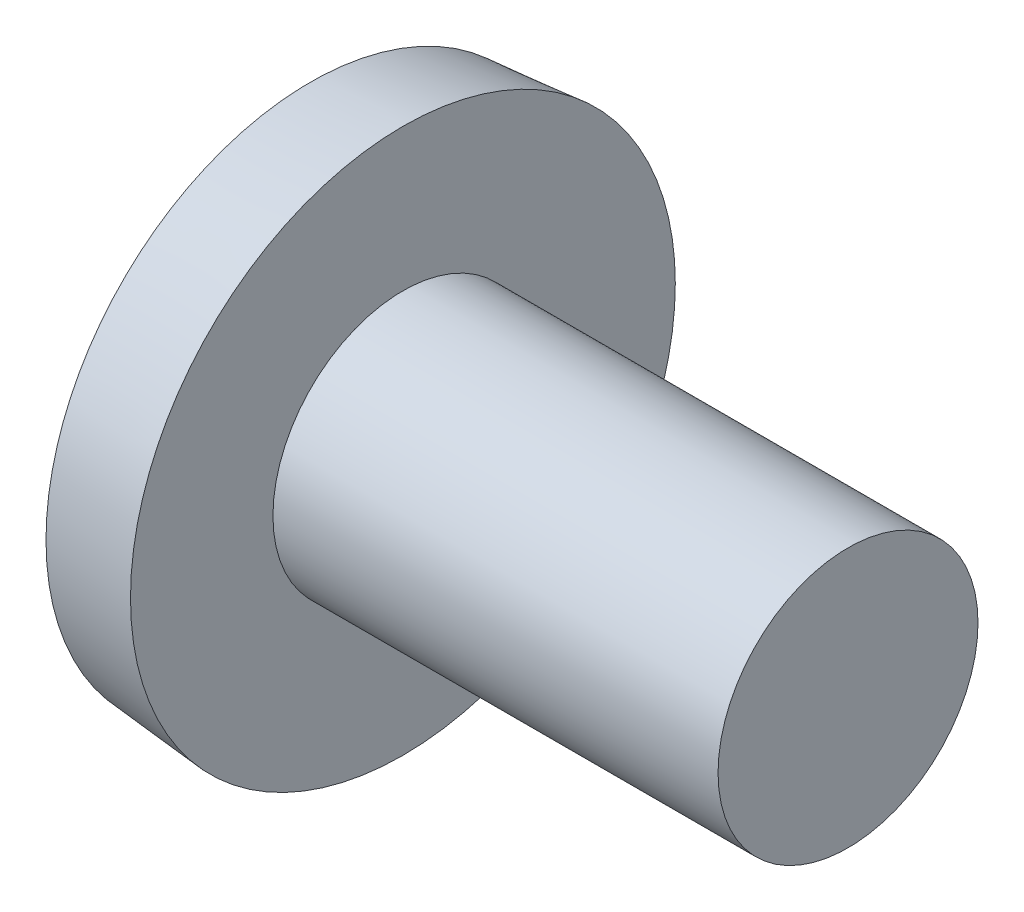
ISO-10303-21;
HEADER;
FILE_DESCRIPTION(('STEP AP214'),'2;1');
FILE_NAME('part.step','',(''),(''),'','','');
FILE_SCHEMA(('AUTOMOTIVE_DESIGN { 1 0 10303 214 1 1 1 1 }'));
ENDSEC;
DATA;
#1=APPLICATION_CONTEXT('core data for automotive mechanical design processes');
#2=APPLICATION_PROTOCOL_DEFINITION('international standard','automotive_design',2000,#1);
#3=PRODUCT_CONTEXT('',#1,'mechanical');
#4=PRODUCT('Part','Part','',(#3));
#5=PRODUCT_RELATED_PRODUCT_CATEGORY('part','',(#4));
#6=PRODUCT_DEFINITION_FORMATION('','',#4);
#7=PRODUCT_DEFINITION_CONTEXT('part definition',#1,'design');
#8=PRODUCT_DEFINITION('design','',#6,#7);
#9=PRODUCT_DEFINITION_SHAPE('','',#8);
#10=(LENGTH_UNIT() NAMED_UNIT(*) SI_UNIT(.MILLI.,.METRE.));
#11=(NAMED_UNIT(*) PLANE_ANGLE_UNIT() SI_UNIT($,.RADIAN.));
#12=(NAMED_UNIT(*) SI_UNIT($,.STERADIAN.) SOLID_ANGLE_UNIT());
#13=UNCERTAINTY_MEASURE_WITH_UNIT(LENGTH_MEASURE(1.E-05),#10,'distance_accuracy_value','');
#14=(GEOMETRIC_REPRESENTATION_CONTEXT(3) GLOBAL_UNCERTAINTY_ASSIGNED_CONTEXT((#13)) GLOBAL_UNIT_ASSIGNED_CONTEXT((#10,
#11,#12)) REPRESENTATION_CONTEXT('',''));
#15=CARTESIAN_POINT('',(0.,0.,0.));
#16=DIRECTION('',(0.,0.,1.));
#17=DIRECTION('',(1.,0.,0.));
#18=AXIS2_PLACEMENT_3D('',#15,#16,#17);
#19=CARTESIAN_POINT('',(4.85512057546957,0.,0.));
#20=DIRECTION('',(-1.,0.,0.));
#21=DIRECTION('',(0.,1.,0.));
#22=AXIS2_PLACEMENT_3D('',#19,#20,#21);
#23=SPHERICAL_SURFACE('',#22,4.85512057546957);
#24=CARTESIAN_POINT('',(0.380999999999999,0.,0.));
#25=DIRECTION('',(-1.,0.,0.));
#26=DIRECTION('',(0.,0.,1.));
#27=AXIS2_PLACEMENT_3D('',#24,#25,#26);
#28=CIRCLE('',#27,1.88532248660748);
#29=CARTESIAN_POINT('',(0.380999999999999,0.,1.88532248660748));
#30=VERTEX_POINT('',#29);
#31=EDGE_CURVE('E153',#30,#30,#28,.T.);
#32=ORIENTED_EDGE('',*,*,#31,.T.);
#33=EDGE_LOOP('',(#32));
#34=FACE_BOUND('',#33,.T.);
#35=CARTESIAN_POINT('',(4.82161757223413,0.,-0.273384506401241));
#36=DIRECTION('',(-0.121639020177934,0.,-0.99257440465194));
#37=DIRECTION('',(-0.99257440465194,0.,0.121639020177934));
#38=AXIS2_PLACEMENT_3D('',#35,#36,#37);
#39=CIRCLE('',#38,4.84730175074566);
#40=CARTESIAN_POINT('',(0.139616751151113,1.11623710321305,0.300390104025599));
#41=VERTEX_POINT('',#40);
#42=CARTESIAN_POINT('',(0.0204791183434092,0.314990304124582,0.314990304124582));
#43=VERTEX_POINT('',#42);
#44=EDGE_CURVE('E124',#41,#43,#39,.F.);
#45=ORIENTED_EDGE('',*,*,#44,.T.);
#46=CARTESIAN_POINT('',(4.82161757223413,-0.273384506401242,0.));
#47=DIRECTION('',(-0.121639020177934,-0.99257440465194,0.));
#48=DIRECTION('',(0.99257440465194,-0.121639020177934,0.));
#49=AXIS2_PLACEMENT_3D('',#46,#47,#48);
#50=CIRCLE('',#49,4.84730175074566);
#51=CARTESIAN_POINT('',(0.139616751151112,0.300390104025596,1.11623710321305));
#52=VERTEX_POINT('',#51);
#53=EDGE_CURVE('E105',#43,#52,#50,.F.);
#54=ORIENTED_EDGE('',*,*,#53,.T.);
#55=CARTESIAN_POINT('',(3.48435644539866,0.,-1.65465019251163));
#56=DIRECTION('',(0.637953912582579,0.,0.770074545365953));
#57=DIRECTION('',(0.770074545365953,0.,-0.637953912582579));
#58=AXIS2_PLACEMENT_3D('',#55,#56,#57);
#59=CIRCLE('',#58,4.35377241509936);
#60=CARTESIAN_POINT('',(0.139616751151112,-0.300390104025603,1.11623710321305));
#61=VERTEX_POINT('',#60);
#62=EDGE_CURVE('E116',#61,#52,#59,.F.);
#63=ORIENTED_EDGE('',*,*,#62,.F.);
#64=CARTESIAN_POINT('',(4.82161757223413,0.273384506401241,0.));
#65=DIRECTION('',(-0.121639020177934,0.99257440465194,0.));
#66=DIRECTION('',(-0.99257440465194,-0.121639020177934,0.));
#67=AXIS2_PLACEMENT_3D('',#64,#65,#66);
#68=CIRCLE('',#67,4.84730175074566);
#69=CARTESIAN_POINT('',(0.0204791183434083,-0.314990304124583,0.314990304124582));
#70=VERTEX_POINT('',#69);
#71=EDGE_CURVE('E191',#61,#70,#68,.F.);
#72=ORIENTED_EDGE('',*,*,#71,.T.);
#73=CARTESIAN_POINT('',(0.139616751151111,-1.11623710321305,0.300390104025599));
#74=VERTEX_POINT('',#73);
#75=EDGE_CURVE('E161',#70,#74,#39,.F.);
#76=ORIENTED_EDGE('',*,*,#75,.T.);
#77=CARTESIAN_POINT('',(3.48435644539866,1.65465019251163,0.));
#78=DIRECTION('',(0.637953912582578,-0.770074545365954,0.));
#79=DIRECTION('',(0.770074545365954,0.637953912582578,0.));
#80=AXIS2_PLACEMENT_3D('',#77,#78,#79);
#81=CIRCLE('',#80,4.35377241509936);
#82=CARTESIAN_POINT('',(0.139616751151111,-1.11623710321305,-0.3003901040256));
#83=VERTEX_POINT('',#82);
#84=EDGE_CURVE('E159',#83,#74,#81,.F.);
#85=ORIENTED_EDGE('',*,*,#84,.F.);
#86=CARTESIAN_POINT('',(4.82161757223413,0.,0.273384506401242));
#87=DIRECTION('',(-0.121639020177934,0.,0.99257440465194));
#88=DIRECTION('',(0.99257440465194,0.,0.121639020177934));
#89=AXIS2_PLACEMENT_3D('',#86,#87,#88);
#90=CIRCLE('',#89,4.84730175074566);
#91=CARTESIAN_POINT('',(0.0204791183434083,-0.314990304124581,-0.314990304124583));
#92=VERTEX_POINT('',#91);
#93=EDGE_CURVE('E163',#83,#92,#90,.F.);
#94=ORIENTED_EDGE('',*,*,#93,.T.);
#95=CARTESIAN_POINT('',(0.139616751151113,-0.300390104025595,-1.11623710321305));
#96=VERTEX_POINT('',#95);
#97=EDGE_CURVE('E189',#92,#96,#68,.F.);
#98=ORIENTED_EDGE('',*,*,#97,.T.);
#99=CARTESIAN_POINT('',(3.48435644539866,0.,1.65465019251163));
#100=DIRECTION('',(0.637953912582578,0.,-0.770074545365954));
#101=DIRECTION('',(-0.770074545365954,0.,-0.637953912582578));
#102=AXIS2_PLACEMENT_3D('',#99,#100,#101);
#103=CIRCLE('',#102,4.35377241509936);
#104=CARTESIAN_POINT('',(0.139616751151113,0.300390104025604,-1.11623710321305));
#105=VERTEX_POINT('',#104);
#106=EDGE_CURVE('E117',#105,#96,#103,.F.);
#107=ORIENTED_EDGE('',*,*,#106,.F.);
#108=CARTESIAN_POINT('',(0.0204791183434083,0.314990304124584,-0.314990304124583));
#109=VERTEX_POINT('',#108);
#110=EDGE_CURVE('E140',#105,#109,#50,.F.);
#111=ORIENTED_EDGE('',*,*,#110,.T.);
#112=CARTESIAN_POINT('',(0.139616751151113,1.11623710321305,-0.300390104025599));
#113=VERTEX_POINT('',#112);
#114=EDGE_CURVE('E56',#109,#113,#90,.F.);
#115=ORIENTED_EDGE('',*,*,#114,.T.);
#116=CARTESIAN_POINT('',(3.48435644539866,-1.65465019251164,0.));
#117=DIRECTION('',(0.637953912582579,0.770074545365953,0.));
#118=DIRECTION('',(-0.770074545365953,0.637953912582579,0.));
#119=AXIS2_PLACEMENT_3D('',#116,#117,#118);
#120=CIRCLE('',#119,4.35377241509936);
#121=EDGE_CURVE('E41',#41,#113,#120,.F.);
#122=ORIENTED_EDGE('',*,*,#121,.F.);
#123=EDGE_LOOP('',(#45,#54,#63,#72,#76,#85,#94,#98,#107,#111,#115,#122));
#124=FACE_BOUND('',#123,.T.);
#125=ADVANCED_FACE('F33',(#34,#124),#23,.T.);
#126=CARTESIAN_POINT('',(1.48702721893491,0.,-0.135266272189349));
#127=DIRECTION('',(-0.121639020177934,0.,0.99257440465194));
#128=DIRECTION('',(0.99257440465194,0.,0.121639020177934));
#129=AXIS2_PLACEMENT_3D('',#126,#127,#128);
#130=PLANE('',#129);
#131=ORIENTED_EDGE('',*,*,#114,.F.);
#132=DIRECTION('',(0.985311808447269,-0.120748996133245,0.120748996133244));
#133=VECTOR('',#132,1.);
#134=CARTESIAN_POINT('',(1.50312057936429,0.133294046646534,-0.133294046646533));
#135=LINE('',#134,#133);
#136=CARTESIAN_POINT('',(1.2954,0.158750000000001,-0.15875));
#137=VERTEX_POINT('',#136);
#138=EDGE_CURVE('E142',#109,#137,#135,.T.);
#139=ORIENTED_EDGE('',*,*,#138,.T.);
#140=DIRECTION('',(0.766668119993595,-0.635131922935871,0.0939544264698036));
#141=VECTOR('',#140,1.);
#142=CARTESIAN_POINT('',(0.,1.2319,-0.317500000000001));
#143=LINE('',#142,#141);
#144=EDGE_CURVE('E126',#113,#137,#143,.T.);
#145=ORIENTED_EDGE('',*,*,#144,.F.);
#146=EDGE_LOOP('',(#131,#139,#145));
#147=FACE_BOUND('',#146,.T.);
#148=ADVANCED_FACE('F167',(#147),#130,.T.);
#149=DIRECTION('',(0.766668119993596,0.63513192293587,0.0939544264698037));
#150=VECTOR('',#149,1.);
#151=CARTESIAN_POINT('',(0.,-1.2319,-0.317500000000001));
#152=LINE('',#151,#150);
#153=CARTESIAN_POINT('',(1.2954,-0.15875,-0.15875));
#154=VERTEX_POINT('',#153);
#155=EDGE_CURVE('E48',#83,#154,#152,.T.);
#156=ORIENTED_EDGE('',*,*,#155,.T.);
#157=DIRECTION('',(-0.985311808447269,-0.120748996133243,-0.120748996133244));
#158=VECTOR('',#157,1.);
#159=CARTESIAN_POINT('',(1.50312057936429,-0.133294046646533,-0.133294046646533));
#160=LINE('',#159,#158);
#161=EDGE_CURVE('E187',#154,#92,#160,.T.);
#162=ORIENTED_EDGE('',*,*,#161,.T.);
#163=ORIENTED_EDGE('',*,*,#93,.F.);
#164=EDGE_LOOP('',(#156,#162,#163));
#165=FACE_BOUND('',#164,.T.);
#166=ADVANCED_FACE('F193',(#165),#130,.T.);
#167=CARTESIAN_POINT('',(1.48702721893491,0.,0.135266272189349));
#168=DIRECTION('',(-0.121639020177934,0.,-0.99257440465194));
#169=DIRECTION('',(-0.99257440465194,0.,0.121639020177934));
#170=AXIS2_PLACEMENT_3D('',#167,#168,#169);
#171=PLANE('',#170);
#172=DIRECTION('',(0.766668119993595,-0.635131922935871,-0.0939544264698034));
#173=VECTOR('',#172,1.);
#174=CARTESIAN_POINT('',(0.,1.2319,0.3175));
#175=LINE('',#174,#173);
#176=CARTESIAN_POINT('',(1.2954,0.15875,0.158750000000001));
#177=VERTEX_POINT('',#176);
#178=EDGE_CURVE('E121',#41,#177,#175,.T.);
#179=ORIENTED_EDGE('',*,*,#178,.T.);
#180=DIRECTION('',(-0.985311808447269,0.120748996133244,0.120748996133244));
#181=VECTOR('',#180,1.);
#182=CARTESIAN_POINT('',(1.50312057936429,0.133294046646533,0.133294046646533));
#183=LINE('',#182,#181);
#184=EDGE_CURVE('E11',#177,#43,#183,.T.);
#185=ORIENTED_EDGE('',*,*,#184,.T.);
#186=ORIENTED_EDGE('',*,*,#44,.F.);
#187=EDGE_LOOP('',(#179,#185,#186));
#188=FACE_BOUND('',#187,.T.);
#189=ADVANCED_FACE('F123',(#188),#171,.T.);
#190=ORIENTED_EDGE('',*,*,#75,.F.);
#191=DIRECTION('',(0.985311808447269,0.120748996133244,-0.120748996133244));
#192=VECTOR('',#191,1.);
#193=CARTESIAN_POINT('',(1.50312057936429,-0.133294046646534,0.133294046646533));
#194=LINE('',#193,#192);
#195=CARTESIAN_POINT('',(1.2954,-0.15875,0.15875));
#196=VERTEX_POINT('',#195);
#197=EDGE_CURVE('E201',#70,#196,#194,.T.);
#198=ORIENTED_EDGE('',*,*,#197,.T.);
#199=DIRECTION('',(0.766668119993596,0.63513192293587,-0.0939544264698035));
#200=VECTOR('',#199,1.);
#201=CARTESIAN_POINT('',(0.,-1.2319,0.3175));
#202=LINE('',#201,#200);
#203=EDGE_CURVE('E172',#74,#196,#202,.T.);
#204=ORIENTED_EDGE('',*,*,#203,.F.);
#205=EDGE_LOOP('',(#190,#198,#204));
#206=FACE_BOUND('',#205,.T.);
#207=ADVANCED_FACE('F200',(#206),#171,.T.);
#208=CARTESIAN_POINT('',(-25.4,0.,0.));
#209=DIRECTION('',(-1.,0.,0.));
#210=DIRECTION('',(0.,0.,1.));
#211=AXIS2_PLACEMENT_3D('',#208,#209,#210);
#212=CYLINDRICAL_SURFACE('',#211,0.9271);
#213=CARTESIAN_POINT('',(4.21639999999999,0.,0.));
#214=DIRECTION('',(-1.,0.,0.));
#215=DIRECTION('',(0.,0.,1.));
#216=AXIS2_PLACEMENT_3D('',#213,#214,#215);
#217=CIRCLE('',#216,0.9271);
#218=CARTESIAN_POINT('',(4.21639999999999,0.,0.9271));
#219=VERTEX_POINT('',#218);
#220=EDGE_CURVE('E156',#219,#219,#217,.T.);
#221=ORIENTED_EDGE('',*,*,#220,.T.);
#222=EDGE_LOOP('',(#221));
#223=FACE_BOUND('',#222,.T.);
#224=CARTESIAN_POINT('',(1.0414,0.,0.));
#225=DIRECTION('',(-1.,0.,0.));
#226=DIRECTION('',(0.,0.,1.));
#227=AXIS2_PLACEMENT_3D('',#224,#225,#226);
#228=CIRCLE('',#227,0.9271);
#229=CARTESIAN_POINT('',(1.0414,0.,0.9271));
#230=VERTEX_POINT('',#229);
#231=EDGE_CURVE('E147',#230,#230,#228,.T.);
#232=ORIENTED_EDGE('',*,*,#231,.F.);
#233=EDGE_LOOP('',(#232));
#234=FACE_BOUND('',#233,.T.);
#235=ADVANCED_FACE('F35',(#223,#234),#212,.T.);
#236=CARTESIAN_POINT('',(4.21639999999999,0.9271,0.));
#237=DIRECTION('',(1.,0.,0.));
#238=DIRECTION('',(0.,0.,-1.));
#239=AXIS2_PLACEMENT_3D('',#236,#237,#238);
#240=PLANE('',#239);
#241=ORIENTED_EDGE('',*,*,#220,.F.);
#242=EDGE_LOOP('',(#241));
#243=FACE_BOUND('',#242,.T.);
#244=ADVANCED_FACE('F232',(#243),#240,.T.);
#245=CARTESIAN_POINT('',(1.0414,0.,0.));
#246=DIRECTION('',(1.,0.,0.));
#247=DIRECTION('',(0.,0.,-1.));
#248=AXIS2_PLACEMENT_3D('',#245,#246,#247);
#249=CONICAL_SURFACE('',#248,1.9431,0.087266462599721);
#250=ORIENTED_EDGE('',*,*,#31,.F.);
#251=EDGE_LOOP('',(#250));
#252=FACE_BOUND('',#251,.T.);
#253=CARTESIAN_POINT('',(1.0414,0.,0.));
#254=DIRECTION('',(-1.,0.,0.));
#255=DIRECTION('',(0.,0.,1.));
#256=AXIS2_PLACEMENT_3D('',#253,#254,#255);
#257=CIRCLE('',#256,1.9431);
#258=CARTESIAN_POINT('',(1.0414,0.,1.9431));
#259=VERTEX_POINT('',#258);
#260=EDGE_CURVE('E150',#259,#259,#257,.T.);
#261=ORIENTED_EDGE('',*,*,#260,.T.);
#262=EDGE_LOOP('',(#261));
#263=FACE_BOUND('',#262,.T.);
#264=ADVANCED_FACE('F230',(#252,#263),#249,.T.);
#265=CARTESIAN_POINT('',(1.0414,0.9271,0.));
#266=DIRECTION('',(-1.,0.,0.));
#267=DIRECTION('',(0.,0.,1.));
#268=AXIS2_PLACEMENT_3D('',#265,#266,#267);
#269=PLANE('',#268);
#270=ORIENTED_EDGE('',*,*,#260,.F.);
#271=EDGE_LOOP('',(#270));
#272=FACE_BOUND('',#271,.T.);
#273=ORIENTED_EDGE('',*,*,#231,.T.);
#274=EDGE_LOOP('',(#273));
#275=FACE_BOUND('',#274,.T.);
#276=ADVANCED_FACE('F239',(#272,#275),#269,.F.);
#277=CARTESIAN_POINT('',(1.2954,0.15875,0.15875));
#278=DIRECTION('',(-1.,0.,0.));
#279=DIRECTION('',(0.,0.,1.));
#280=AXIS2_PLACEMENT_3D('',#277,#278,#279);
#281=PLANE('',#280);
#282=DIRECTION('',(0.,1.,0.));
#283=VECTOR('',#282,1.);
#284=CARTESIAN_POINT('',(1.2954,-0.15875,0.15875));
#285=LINE('',#284,#283);
#286=EDGE_CURVE('E113',#196,#177,#285,.T.);
#287=ORIENTED_EDGE('',*,*,#286,.T.);
#288=DIRECTION('',(0.,0.,-1.));
#289=VECTOR('',#288,1.);
#290=CARTESIAN_POINT('',(1.2954,0.15875,0.15875));
#291=LINE('',#290,#289);
#292=EDGE_CURVE('E130',#177,#137,#291,.T.);
#293=ORIENTED_EDGE('',*,*,#292,.T.);
#294=DIRECTION('',(0.,-1.,0.));
#295=VECTOR('',#294,1.);
#296=CARTESIAN_POINT('',(1.2954,0.15875,-0.15875));
#297=LINE('',#296,#295);
#298=EDGE_CURVE('E135',#137,#154,#297,.T.);
#299=ORIENTED_EDGE('',*,*,#298,.T.);
#300=DIRECTION('',(0.,0.,1.));
#301=VECTOR('',#300,1.);
#302=CARTESIAN_POINT('',(1.2954,-0.15875,-0.15875));
#303=LINE('',#302,#301);
#304=EDGE_CURVE('E139',#154,#196,#303,.T.);
#305=ORIENTED_EDGE('',*,*,#304,.T.);
#306=EDGE_LOOP('',(#287,#293,#299,#305));
#307=FACE_BOUND('',#306,.T.);
#308=ADVANCED_FACE('F138',(#307),#281,.T.);
#309=CARTESIAN_POINT('',(1.2954,0.15875,0.15875));
#310=DIRECTION('',(0.637953912582579,0.770074545365953,0.));
#311=DIRECTION('',(-0.770074545365953,0.637953912582579,0.));
#312=AXIS2_PLACEMENT_3D('',#309,#310,#311);
#313=PLANE('',#312);
#314=ORIENTED_EDGE('',*,*,#121,.T.);
#315=ORIENTED_EDGE('',*,*,#144,.T.);
#316=ORIENTED_EDGE('',*,*,#292,.F.);
#317=ORIENTED_EDGE('',*,*,#178,.F.);
#318=EDGE_LOOP('',(#314,#315,#316,#317));
#319=FACE_BOUND('',#318,.T.);
#320=ADVANCED_FACE('F131',(#319),#313,.F.);
#321=CARTESIAN_POINT('',(1.2954,-0.15875,-0.15875));
#322=DIRECTION('',(0.637953912582578,-0.770074545365954,0.));
#323=DIRECTION('',(0.770074545365954,0.637953912582578,0.));
#324=AXIS2_PLACEMENT_3D('',#321,#322,#323);
#325=PLANE('',#324);
#326=ORIENTED_EDGE('',*,*,#84,.T.);
#327=ORIENTED_EDGE('',*,*,#203,.T.);
#328=ORIENTED_EDGE('',*,*,#304,.F.);
#329=ORIENTED_EDGE('',*,*,#155,.F.);
#330=EDGE_LOOP('',(#326,#327,#328,#329));
#331=FACE_BOUND('',#330,.T.);
#332=ADVANCED_FACE('F195',(#331),#325,.F.);
#333=CARTESIAN_POINT('',(1.48702721893491,0.135266272189349,0.));
#334=DIRECTION('',(-0.121639020177934,-0.99257440465194,0.));
#335=DIRECTION('',(0.99257440465194,-0.121639020177934,0.));
#336=AXIS2_PLACEMENT_3D('',#333,#334,#335);
#337=PLANE('',#336);
#338=ORIENTED_EDGE('',*,*,#184,.F.);
#339=DIRECTION('',(0.766668119993595,-0.0939544264698014,-0.635131922935871));
#340=VECTOR('',#339,1.);
#341=CARTESIAN_POINT('',(0.,0.317499999999996,1.2319));
#342=LINE('',#341,#340);
#343=EDGE_CURVE('E103',#52,#177,#342,.T.);
#344=ORIENTED_EDGE('',*,*,#343,.F.);
#345=ORIENTED_EDGE('',*,*,#53,.F.);
#346=EDGE_LOOP('',(#338,#344,#345));
#347=FACE_BOUND('',#346,.T.);
#348=ADVANCED_FACE('F102',(#347),#337,.T.);
#349=CARTESIAN_POINT('',(1.48702721893491,-0.135266272189349,0.));
#350=DIRECTION('',(-0.121639020177934,0.99257440465194,0.));
#351=DIRECTION('',(-0.99257440465194,-0.121639020177934,0.));
#352=AXIS2_PLACEMENT_3D('',#349,#350,#351);
#353=PLANE('',#352);
#354=DIRECTION('',(0.766668119993595,0.0939544264698056,-0.63513192293587));
#355=VECTOR('',#354,1.);
#356=CARTESIAN_POINT('',(0.,-0.317500000000004,1.2319));
#357=LINE('',#356,#355);
#358=EDGE_CURVE('E118',#61,#196,#357,.T.);
#359=ORIENTED_EDGE('',*,*,#358,.T.);
#360=ORIENTED_EDGE('',*,*,#197,.F.);
#361=ORIENTED_EDGE('',*,*,#71,.F.);
#362=EDGE_LOOP('',(#359,#360,#361));
#363=FACE_BOUND('',#362,.T.);
#364=ADVANCED_FACE('F208',(#363),#353,.T.);
#365=CARTESIAN_POINT('',(1.2954,-0.158750000000001,0.15875));
#366=DIRECTION('',(0.637953912582579,0.,0.770074545365953));
#367=DIRECTION('',(-0.770074545365953,0.,0.637953912582579));
#368=AXIS2_PLACEMENT_3D('',#365,#366,#367);
#369=PLANE('',#368);
#370=ORIENTED_EDGE('',*,*,#62,.T.);
#371=ORIENTED_EDGE('',*,*,#343,.T.);
#372=ORIENTED_EDGE('',*,*,#286,.F.);
#373=ORIENTED_EDGE('',*,*,#358,.F.);
#374=EDGE_LOOP('',(#370,#371,#372,#373));
#375=FACE_BOUND('',#374,.T.);
#376=ADVANCED_FACE('F110',(#375),#369,.F.);
#377=DIRECTION('',(0.766668119993596,-0.093954426469806,0.63513192293587));
#378=VECTOR('',#377,1.);
#379=CARTESIAN_POINT('',(0.,0.317500000000005,-1.2319));
#380=LINE('',#379,#378);
#381=EDGE_CURVE('E178',#105,#137,#380,.T.);
#382=ORIENTED_EDGE('',*,*,#381,.T.);
#383=ORIENTED_EDGE('',*,*,#138,.F.);
#384=ORIENTED_EDGE('',*,*,#110,.F.);
#385=EDGE_LOOP('',(#382,#383,#384));
#386=FACE_BOUND('',#385,.T.);
#387=ADVANCED_FACE('F212',(#386),#337,.T.);
#388=ORIENTED_EDGE('',*,*,#161,.F.);
#389=DIRECTION('',(0.766668119993596,0.0939544264698013,0.63513192293587));
#390=VECTOR('',#389,1.);
#391=CARTESIAN_POINT('',(0.,-0.317499999999996,-1.2319));
#392=LINE('',#391,#390);
#393=EDGE_CURVE('E181',#96,#154,#392,.T.);
#394=ORIENTED_EDGE('',*,*,#393,.F.);
#395=ORIENTED_EDGE('',*,*,#97,.F.);
#396=EDGE_LOOP('',(#388,#394,#395));
#397=FACE_BOUND('',#396,.T.);
#398=ADVANCED_FACE('F188',(#397),#353,.T.);
#399=CARTESIAN_POINT('',(1.2954,0.158750000000001,-0.15875));
#400=DIRECTION('',(0.637953912582578,0.,-0.770074545365954));
#401=DIRECTION('',(0.770074545365954,0.,0.637953912582578));
#402=AXIS2_PLACEMENT_3D('',#399,#400,#401);
#403=PLANE('',#402);
#404=ORIENTED_EDGE('',*,*,#106,.T.);
#405=ORIENTED_EDGE('',*,*,#393,.T.);
#406=ORIENTED_EDGE('',*,*,#298,.F.);
#407=ORIENTED_EDGE('',*,*,#381,.F.);
#408=EDGE_LOOP('',(#404,#405,#406,#407));
#409=FACE_BOUND('',#408,.T.);
#410=ADVANCED_FACE('F177',(#409),#403,.F.);
#411=CLOSED_SHELL('',(#125,#148,#166,#189,#207,#235,#244,#264,#276,#308,#320,#332,#348,#364,
#376,#387,#398,#410));
#412=MANIFOLD_SOLID_BREP('B2',#411);
#413=ADVANCED_BREP_SHAPE_REPRESENTATION('',(#18,#412),#14);
#414=SHAPE_DEFINITION_REPRESENTATION(#9,#413);
ENDSEC;
END-ISO-10303-21;
